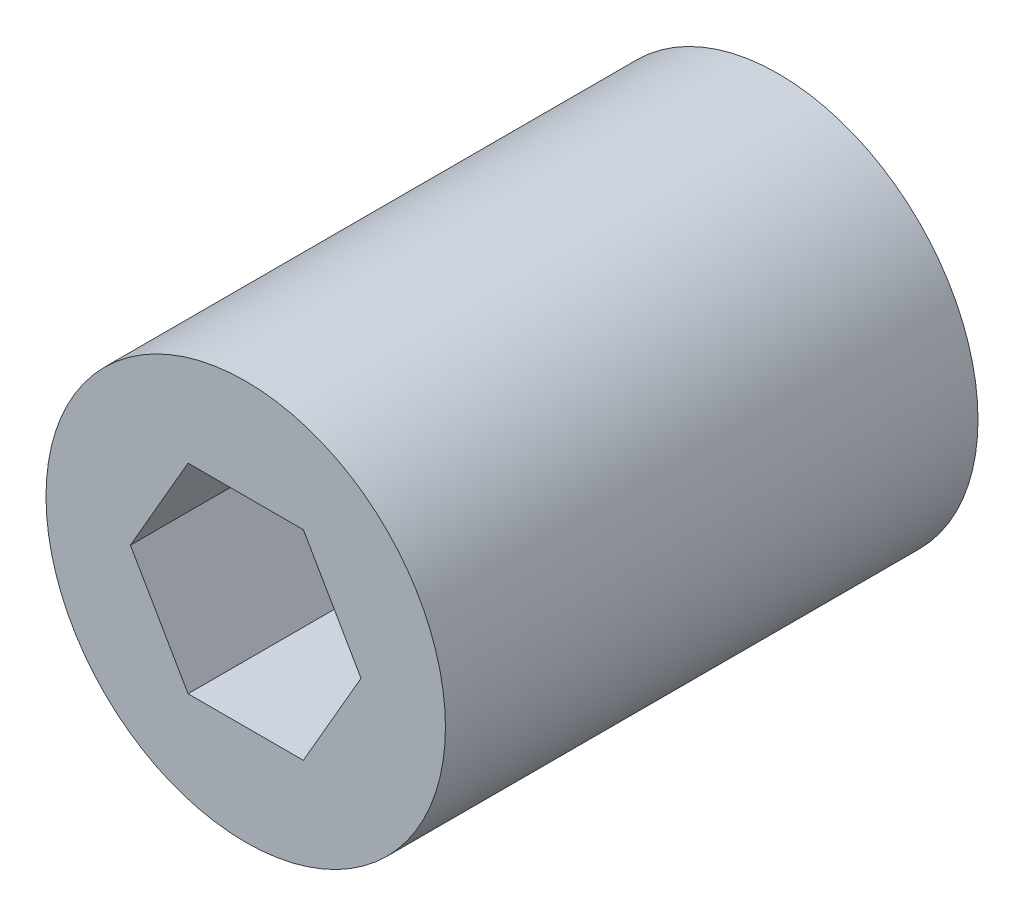
ISO-10303-21;
HEADER;
FILE_DESCRIPTION(('STEP AP214'),'2;1');
FILE_NAME('part.step','',(''),(''),'','','');
FILE_SCHEMA(('AUTOMOTIVE_DESIGN { 1 0 10303 214 1 1 1 1 }'));
ENDSEC;
DATA;
#1=APPLICATION_CONTEXT('core data for automotive mechanical design processes');
#2=APPLICATION_PROTOCOL_DEFINITION('international standard','automotive_design',2000,#1);
#3=PRODUCT_CONTEXT('',#1,'mechanical');
#4=PRODUCT('Part','Part','',(#3));
#5=PRODUCT_RELATED_PRODUCT_CATEGORY('part','',(#4));
#6=PRODUCT_DEFINITION_FORMATION('','',#4);
#7=PRODUCT_DEFINITION_CONTEXT('part definition',#1,'design');
#8=PRODUCT_DEFINITION('design','',#6,#7);
#9=PRODUCT_DEFINITION_SHAPE('','',#8);
#10=(LENGTH_UNIT() NAMED_UNIT(*) SI_UNIT(.MILLI.,.METRE.));
#11=(NAMED_UNIT(*) PLANE_ANGLE_UNIT() SI_UNIT($,.RADIAN.));
#12=(NAMED_UNIT(*) SI_UNIT($,.STERADIAN.) SOLID_ANGLE_UNIT());
#13=UNCERTAINTY_MEASURE_WITH_UNIT(LENGTH_MEASURE(1.E-05),#10,'distance_accuracy_value','');
#14=(GEOMETRIC_REPRESENTATION_CONTEXT(3) GLOBAL_UNCERTAINTY_ASSIGNED_CONTEXT((#13)) GLOBAL_UNIT_ASSIGNED_CONTEXT((#10,
#11,#12)) REPRESENTATION_CONTEXT('',''));
#15=CARTESIAN_POINT('',(0.,0.,0.));
#16=DIRECTION('',(0.,0.,1.));
#17=DIRECTION('',(1.,0.,0.));
#18=AXIS2_PLACEMENT_3D('',#15,#16,#17);
#19=CARTESIAN_POINT('',(0.,0.,4.));
#20=DIRECTION('',(0.,0.,1.));
#21=DIRECTION('',(1.,0.,0.));
#22=AXIS2_PLACEMENT_3D('',#19,#20,#21);
#23=PLANE('',#22);
#24=CARTESIAN_POINT('',(0.,0.,4.));
#25=DIRECTION('',(0.,0.,1.));
#26=DIRECTION('',(1.,0.,0.));
#27=AXIS2_PLACEMENT_3D('',#24,#25,#26);
#28=CIRCLE('',#27,1.5);
#29=CARTESIAN_POINT('',(1.5,0.,4.));
#30=VERTEX_POINT('',#29);
#31=EDGE_CURVE('E129',#30,#30,#28,.T.);
#32=ORIENTED_EDGE('',*,*,#31,.T.);
#33=EDGE_LOOP('',(#32));
#34=FACE_BOUND('',#33,.T.);
#35=DIRECTION('',(0.5,-0.866025403784439,0.));
#36=VECTOR('',#35,1.);
#37=CARTESIAN_POINT('',(0.649519052838329,0.375,4.));
#38=LINE('',#37,#36);
#39=CARTESIAN_POINT('',(0.433012701892219,0.75,4.));
#40=VERTEX_POINT('',#39);
#41=CARTESIAN_POINT('',(0.866025403784439,0.,4.));
#42=VERTEX_POINT('',#41);
#43=EDGE_CURVE('E50',#40,#42,#38,.T.);
#44=ORIENTED_EDGE('',*,*,#43,.T.);
#45=DIRECTION('',(-0.5,-0.866025403784439,0.));
#46=VECTOR('',#45,1.);
#47=CARTESIAN_POINT('',(0.649519052838329,-0.375,4.));
#48=LINE('',#47,#46);
#49=CARTESIAN_POINT('',(0.433012701892219,-0.75,4.));
#50=VERTEX_POINT('',#49);
#51=EDGE_CURVE('E11',#42,#50,#48,.T.);
#52=ORIENTED_EDGE('',*,*,#51,.T.);
#53=DIRECTION('',(-1.,0.,0.));
#54=VECTOR('',#53,1.);
#55=CARTESIAN_POINT('',(0.,-0.75,4.));
#56=LINE('',#55,#54);
#57=CARTESIAN_POINT('',(-0.43301270189222,-0.75,4.));
#58=VERTEX_POINT('',#57);
#59=EDGE_CURVE('E131',#50,#58,#56,.T.);
#60=ORIENTED_EDGE('',*,*,#59,.T.);
#61=DIRECTION('',(-0.5,0.866025403784439,0.));
#62=VECTOR('',#61,1.);
#63=CARTESIAN_POINT('',(-0.649519052838329,-0.375,4.));
#64=LINE('',#63,#62);
#65=CARTESIAN_POINT('',(-0.866025403784439,0.,4.));
#66=VERTEX_POINT('',#65);
#67=EDGE_CURVE('E140',#58,#66,#64,.T.);
#68=ORIENTED_EDGE('',*,*,#67,.T.);
#69=DIRECTION('',(0.5,0.866025403784439,0.));
#70=VECTOR('',#69,1.);
#71=CARTESIAN_POINT('',(-0.649519052838329,0.375,4.));
#72=LINE('',#71,#70);
#73=CARTESIAN_POINT('',(-0.433012701892219,0.75,4.));
#74=VERTEX_POINT('',#73);
#75=EDGE_CURVE('E139',#66,#74,#72,.T.);
#76=ORIENTED_EDGE('',*,*,#75,.T.);
#77=DIRECTION('',(1.,0.,0.));
#78=VECTOR('',#77,1.);
#79=CARTESIAN_POINT('',(0.,0.75,4.));
#80=LINE('',#79,#78);
#81=EDGE_CURVE('E141',#74,#40,#80,.T.);
#82=ORIENTED_EDGE('',*,*,#81,.T.);
#83=EDGE_LOOP('',(#44,#52,#60,#68,#76,#82));
#84=FACE_BOUND('',#83,.T.);
#85=ADVANCED_FACE('F39',(#34,#84),#23,.T.);
#86=CARTESIAN_POINT('',(0.,0.,4.));
#87=DIRECTION('',(0.,0.,-1.));
#88=DIRECTION('',(-1.,0.,0.));
#89=AXIS2_PLACEMENT_3D('',#86,#87,#88);
#90=CYLINDRICAL_SURFACE('',#89,1.5);
#91=ORIENTED_EDGE('',*,*,#31,.F.);
#92=EDGE_LOOP('',(#91));
#93=FACE_BOUND('',#92,.T.);
#94=CARTESIAN_POINT('',(0.,0.,0.));
#95=DIRECTION('',(0.,0.,1.));
#96=DIRECTION('',(1.,0.,0.));
#97=AXIS2_PLACEMENT_3D('',#94,#95,#96);
#98=CIRCLE('',#97,1.5);
#99=CARTESIAN_POINT('',(1.5,0.,0.));
#100=VERTEX_POINT('',#99);
#101=EDGE_CURVE('E96',#100,#100,#98,.T.);
#102=ORIENTED_EDGE('',*,*,#101,.T.);
#103=EDGE_LOOP('',(#102));
#104=FACE_BOUND('',#103,.T.);
#105=ADVANCED_FACE('F41',(#93,#104),#90,.T.);
#106=CARTESIAN_POINT('',(0.,0.,0.));
#107=DIRECTION('',(0.,0.,1.));
#108=DIRECTION('',(1.,0.,0.));
#109=AXIS2_PLACEMENT_3D('',#106,#107,#108);
#110=PLANE('',#109);
#111=ORIENTED_EDGE('',*,*,#101,.F.);
#112=EDGE_LOOP('',(#111));
#113=FACE_BOUND('',#112,.T.);
#114=ADVANCED_FACE('F175',(#113),#110,.F.);
#115=CARTESIAN_POINT('',(0.433012701892219,-0.75,4.1));
#116=DIRECTION('',(-0.866025403784439,0.5,0.));
#117=DIRECTION('',(-0.5,-0.866025403784439,0.));
#118=AXIS2_PLACEMENT_3D('',#115,#116,#117);
#119=PLANE('',#118);
#120=DIRECTION('',(0.,0.,-1.));
#121=VECTOR('',#120,1.);
#122=CARTESIAN_POINT('',(0.866025403784439,0.,4.1));
#123=LINE('',#122,#121);
#124=CARTESIAN_POINT('',(0.866025403784439,0.,2.8));
#125=VERTEX_POINT('',#124);
#126=EDGE_CURVE('E90',#42,#125,#123,.T.);
#127=ORIENTED_EDGE('',*,*,#126,.T.);
#128=DIRECTION('',(0.5,0.866025403784439,0.));
#129=VECTOR('',#128,1.);
#130=CARTESIAN_POINT('',(0.433012701892219,-0.75,2.8));
#131=LINE('',#130,#129);
#132=CARTESIAN_POINT('',(0.433012701892219,-0.75,2.8));
#133=VERTEX_POINT('',#132);
#134=EDGE_CURVE('E91',#133,#125,#131,.T.);
#135=ORIENTED_EDGE('',*,*,#134,.F.);
#136=DIRECTION('',(0.,0.,-1.));
#137=VECTOR('',#136,1.);
#138=CARTESIAN_POINT('',(0.433012701892219,-0.75,4.1));
#139=LINE('',#138,#137);
#140=EDGE_CURVE('E123',#50,#133,#139,.T.);
#141=ORIENTED_EDGE('',*,*,#140,.F.);
#142=ORIENTED_EDGE('',*,*,#51,.F.);
#143=EDGE_LOOP('',(#127,#135,#141,#142));
#144=FACE_BOUND('',#143,.T.);
#145=ADVANCED_FACE('F93',(#144),#119,.T.);
#146=CARTESIAN_POINT('',(0.866025403784439,0.,4.1));
#147=DIRECTION('',(-0.866025403784439,-0.5,0.));
#148=DIRECTION('',(0.5,-0.866025403784439,0.));
#149=AXIS2_PLACEMENT_3D('',#146,#147,#148);
#150=PLANE('',#149);
#151=DIRECTION('',(0.,0.,-1.));
#152=VECTOR('',#151,1.);
#153=CARTESIAN_POINT('',(0.433012701892219,0.75,4.1));
#154=LINE('',#153,#152);
#155=CARTESIAN_POINT('',(0.433012701892219,0.75,2.8));
#156=VERTEX_POINT('',#155);
#157=EDGE_CURVE('E100',#40,#156,#154,.T.);
#158=ORIENTED_EDGE('',*,*,#157,.T.);
#159=DIRECTION('',(-0.5,0.866025403784439,0.));
#160=VECTOR('',#159,1.);
#161=CARTESIAN_POINT('',(0.866025403784439,0.,2.8));
#162=LINE('',#161,#160);
#163=EDGE_CURVE('E99',#125,#156,#162,.T.);
#164=ORIENTED_EDGE('',*,*,#163,.F.);
#165=ORIENTED_EDGE('',*,*,#126,.F.);
#166=ORIENTED_EDGE('',*,*,#43,.F.);
#167=EDGE_LOOP('',(#158,#164,#165,#166));
#168=FACE_BOUND('',#167,.T.);
#169=ADVANCED_FACE('F101',(#168),#150,.T.);
#170=CARTESIAN_POINT('',(0.433012701892219,0.75,4.1));
#171=DIRECTION('',(0.,-1.,0.));
#172=DIRECTION('',(1.,0.,0.));
#173=AXIS2_PLACEMENT_3D('',#170,#171,#172);
#174=PLANE('',#173);
#175=DIRECTION('',(0.,0.,-1.));
#176=VECTOR('',#175,1.);
#177=CARTESIAN_POINT('',(-0.433012701892219,0.75,4.1));
#178=LINE('',#177,#176);
#179=CARTESIAN_POINT('',(-0.433012701892219,0.75,2.8));
#180=VERTEX_POINT('',#179);
#181=EDGE_CURVE('E127',#74,#180,#178,.T.);
#182=ORIENTED_EDGE('',*,*,#181,.T.);
#183=DIRECTION('',(-1.,0.,0.));
#184=VECTOR('',#183,1.);
#185=CARTESIAN_POINT('',(0.433012701892219,0.75,2.8));
#186=LINE('',#185,#184);
#187=EDGE_CURVE('E106',#156,#180,#186,.T.);
#188=ORIENTED_EDGE('',*,*,#187,.F.);
#189=ORIENTED_EDGE('',*,*,#157,.F.);
#190=ORIENTED_EDGE('',*,*,#81,.F.);
#191=EDGE_LOOP('',(#182,#188,#189,#190));
#192=FACE_BOUND('',#191,.T.);
#193=ADVANCED_FACE('F150',(#192),#174,.T.);
#194=CARTESIAN_POINT('',(-0.433012701892219,0.75,4.1));
#195=DIRECTION('',(0.866025403784439,-0.5,0.));
#196=DIRECTION('',(0.5,0.866025403784439,0.));
#197=AXIS2_PLACEMENT_3D('',#194,#195,#196);
#198=PLANE('',#197);
#199=DIRECTION('',(0.,0.,-1.));
#200=VECTOR('',#199,1.);
#201=CARTESIAN_POINT('',(-0.866025403784439,0.,4.1));
#202=LINE('',#201,#200);
#203=CARTESIAN_POINT('',(-0.866025403784439,0.,2.8));
#204=VERTEX_POINT('',#203);
#205=EDGE_CURVE('E122',#66,#204,#202,.T.);
#206=ORIENTED_EDGE('',*,*,#205,.T.);
#207=DIRECTION('',(-0.5,-0.866025403784439,0.));
#208=VECTOR('',#207,1.);
#209=CARTESIAN_POINT('',(-0.433012701892219,0.75,2.8));
#210=LINE('',#209,#208);
#211=EDGE_CURVE('E113',#180,#204,#210,.T.);
#212=ORIENTED_EDGE('',*,*,#211,.F.);
#213=ORIENTED_EDGE('',*,*,#181,.F.);
#214=ORIENTED_EDGE('',*,*,#75,.F.);
#215=EDGE_LOOP('',(#206,#212,#213,#214));
#216=FACE_BOUND('',#215,.T.);
#217=ADVANCED_FACE('F155',(#216),#198,.T.);
#218=CARTESIAN_POINT('',(-0.866025403784439,0.,4.1));
#219=DIRECTION('',(0.866025403784439,0.5,0.));
#220=DIRECTION('',(-0.5,0.866025403784439,0.));
#221=AXIS2_PLACEMENT_3D('',#218,#219,#220);
#222=PLANE('',#221);
#223=DIRECTION('',(0.,0.,-1.));
#224=VECTOR('',#223,1.);
#225=CARTESIAN_POINT('',(-0.43301270189222,-0.75,4.1));
#226=LINE('',#225,#224);
#227=CARTESIAN_POINT('',(-0.43301270189222,-0.75,2.8));
#228=VERTEX_POINT('',#227);
#229=EDGE_CURVE('E53',#58,#228,#226,.T.);
#230=ORIENTED_EDGE('',*,*,#229,.T.);
#231=DIRECTION('',(0.5,-0.866025403784439,0.));
#232=VECTOR('',#231,1.);
#233=CARTESIAN_POINT('',(-0.866025403784439,0.,2.8));
#234=LINE('',#233,#232);
#235=EDGE_CURVE('E120',#204,#228,#234,.T.);
#236=ORIENTED_EDGE('',*,*,#235,.F.);
#237=ORIENTED_EDGE('',*,*,#205,.F.);
#238=ORIENTED_EDGE('',*,*,#67,.F.);
#239=EDGE_LOOP('',(#230,#236,#237,#238));
#240=FACE_BOUND('',#239,.T.);
#241=ADVANCED_FACE('F154',(#240),#222,.T.);
#242=CARTESIAN_POINT('',(-0.43301270189222,-0.75,4.1));
#243=DIRECTION('',(0.,1.,0.));
#244=DIRECTION('',(-1.,0.,0.));
#245=AXIS2_PLACEMENT_3D('',#242,#243,#244);
#246=PLANE('',#245);
#247=ORIENTED_EDGE('',*,*,#140,.T.);
#248=DIRECTION('',(1.,0.,0.));
#249=VECTOR('',#248,1.);
#250=CARTESIAN_POINT('',(-0.43301270189222,-0.75,2.8));
#251=LINE('',#250,#249);
#252=EDGE_CURVE('E112',#228,#133,#251,.T.);
#253=ORIENTED_EDGE('',*,*,#252,.F.);
#254=ORIENTED_EDGE('',*,*,#229,.F.);
#255=ORIENTED_EDGE('',*,*,#59,.F.);
#256=EDGE_LOOP('',(#247,#253,#254,#255));
#257=FACE_BOUND('',#256,.T.);
#258=ADVANCED_FACE('F156',(#257),#246,.T.);
#259=CARTESIAN_POINT('',(0.,0.,2.8));
#260=DIRECTION('',(0.,0.,1.));
#261=DIRECTION('',(1.,0.,0.));
#262=AXIS2_PLACEMENT_3D('',#259,#260,#261);
#263=PLANE('',#262);
#264=ORIENTED_EDGE('',*,*,#134,.T.);
#265=ORIENTED_EDGE('',*,*,#163,.T.);
#266=ORIENTED_EDGE('',*,*,#187,.T.);
#267=ORIENTED_EDGE('',*,*,#211,.T.);
#268=ORIENTED_EDGE('',*,*,#235,.T.);
#269=ORIENTED_EDGE('',*,*,#252,.T.);
#270=EDGE_LOOP('',(#264,#265,#266,#267,#268,#269));
#271=FACE_BOUND('',#270,.T.);
#272=ADVANCED_FACE('F108',(#271),#263,.T.);
#273=CLOSED_SHELL('',(#85,#105,#114,#145,#169,#193,#217,#241,#258,#272));
#274=MANIFOLD_SOLID_BREP('B2',#273);
#275=ADVANCED_BREP_SHAPE_REPRESENTATION('',(#18,#274),#14);
#276=SHAPE_DEFINITION_REPRESENTATION(#9,#275);
ENDSEC;
END-ISO-10303-21;
